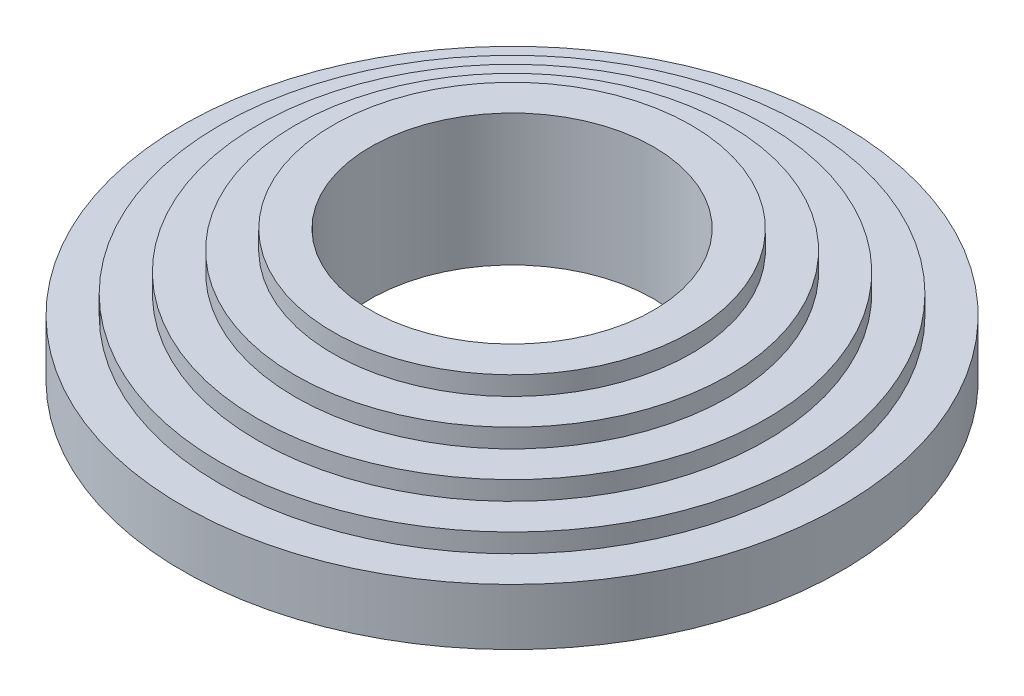
ISO-10303-21;
HEADER;
FILE_DESCRIPTION(('STEP AP214'),'2;1');
FILE_NAME('part.step','',(''),(''),'','','');
FILE_SCHEMA(('AUTOMOTIVE_DESIGN { 1 0 10303 214 1 1 1 1 }'));
ENDSEC;
DATA;
#1=APPLICATION_CONTEXT('core data for automotive mechanical design processes');
#2=APPLICATION_PROTOCOL_DEFINITION('international standard','automotive_design',2000,#1);
#3=PRODUCT_CONTEXT('',#1,'mechanical');
#4=PRODUCT('Part','Part','',(#3));
#5=PRODUCT_RELATED_PRODUCT_CATEGORY('part','',(#4));
#6=PRODUCT_DEFINITION_FORMATION('','',#4);
#7=PRODUCT_DEFINITION_CONTEXT('part definition',#1,'design');
#8=PRODUCT_DEFINITION('design','',#6,#7);
#9=PRODUCT_DEFINITION_SHAPE('','',#8);
#10=(LENGTH_UNIT() NAMED_UNIT(*) SI_UNIT(.MILLI.,.METRE.));
#11=(NAMED_UNIT(*) PLANE_ANGLE_UNIT() SI_UNIT($,.RADIAN.));
#12=(NAMED_UNIT(*) SI_UNIT($,.STERADIAN.) SOLID_ANGLE_UNIT());
#13=UNCERTAINTY_MEASURE_WITH_UNIT(LENGTH_MEASURE(1.E-05),#10,'distance_accuracy_value','');
#14=(GEOMETRIC_REPRESENTATION_CONTEXT(3) GLOBAL_UNCERTAINTY_ASSIGNED_CONTEXT((#13)) GLOBAL_UNIT_ASSIGNED_CONTEXT((#10,
#11,#12)) REPRESENTATION_CONTEXT('',''));
#15=CARTESIAN_POINT('',(0.,0.,0.));
#16=DIRECTION('',(0.,0.,1.));
#17=DIRECTION('',(1.,0.,0.));
#18=AXIS2_PLACEMENT_3D('',#15,#16,#17);
#19=CARTESIAN_POINT('',(0.,0.,0.));
#20=DIRECTION('',(0.,-1.,0.));
#21=DIRECTION('',(0.,0.,-1.));
#22=AXIS2_PLACEMENT_3D('',#19,#20,#21);
#23=CYLINDRICAL_SURFACE('',#22,44.73399997);
#24=CARTESIAN_POINT('',(0.,31.2160506837349,0.));
#25=DIRECTION('',(0.,-1.,0.));
#26=DIRECTION('',(0.,0.,-1.));
#27=AXIS2_PLACEMENT_3D('',#24,#25,#26);
#28=CIRCLE('',#27,44.73399997);
#29=CARTESIAN_POINT('',(0.,31.2160506837349,-44.73399997));
#30=VERTEX_POINT('',#29);
#31=EDGE_CURVE('E69',#30,#30,#28,.T.);
#32=ORIENTED_EDGE('',*,*,#31,.F.);
#33=EDGE_LOOP('',(#32));
#34=FACE_BOUND('',#33,.T.);
#35=CARTESIAN_POINT('',(0.,35.0970507957349,0.));
#36=DIRECTION('',(0.,-1.,0.));
#37=DIRECTION('',(0.,0.,-1.));
#38=AXIS2_PLACEMENT_3D('',#35,#36,#37);
#39=CIRCLE('',#38,44.73399997);
#40=CARTESIAN_POINT('',(0.,35.0970507957349,-44.73399997));
#41=VERTEX_POINT('',#40);
#42=EDGE_CURVE('E10',#41,#41,#39,.T.);
#43=ORIENTED_EDGE('',*,*,#42,.T.);
#44=EDGE_LOOP('',(#43));
#45=FACE_BOUND('',#44,.T.);
#46=ADVANCED_FACE('F29',(#34,#45),#23,.T.);
#47=CARTESIAN_POINT('',(-44.73399997,35.0970507957349,0.));
#48=DIRECTION('',(0.,-1.,0.));
#49=DIRECTION('',(0.,0.,-1.));
#50=AXIS2_PLACEMENT_3D('',#47,#48,#49);
#51=PLANE('',#50);
#52=ORIENTED_EDGE('',*,*,#42,.F.);
#53=EDGE_LOOP('',(#52));
#54=FACE_BOUND('',#53,.T.);
#55=CARTESIAN_POINT('',(0.,35.0970507957349,0.));
#56=DIRECTION('',(0.,-1.,0.));
#57=DIRECTION('',(0.,0.,-1.));
#58=AXIS2_PLACEMENT_3D('',#55,#56,#57);
#59=CIRCLE('',#58,36.972);
#60=CARTESIAN_POINT('',(0.,35.0970507957349,-36.972));
#61=VERTEX_POINT('',#60);
#62=EDGE_CURVE('E35',#61,#61,#59,.T.);
#63=ORIENTED_EDGE('',*,*,#62,.T.);
#64=EDGE_LOOP('',(#63));
#65=FACE_BOUND('',#64,.T.);
#66=ADVANCED_FACE('F76',(#54,#65),#51,.F.);
#67=CARTESIAN_POINT('',(0.,0.,0.));
#68=DIRECTION('',(0.,-1.,0.));
#69=DIRECTION('',(0.,0.,-1.));
#70=AXIS2_PLACEMENT_3D('',#67,#68,#69);
#71=CYLINDRICAL_SURFACE('',#70,36.972);
#72=ORIENTED_EDGE('',*,*,#62,.F.);
#73=EDGE_LOOP('',(#72));
#74=FACE_BOUND('',#73,.T.);
#75=CARTESIAN_POINT('',(0.,38.9780509077349,0.));
#76=DIRECTION('',(0.,-1.,0.));
#77=DIRECTION('',(0.,0.,-1.));
#78=AXIS2_PLACEMENT_3D('',#75,#76,#77);
#79=CIRCLE('',#78,36.972);
#80=CARTESIAN_POINT('',(0.,38.9780509077349,-36.972));
#81=VERTEX_POINT('',#80);
#82=EDGE_CURVE('E39',#81,#81,#79,.T.);
#83=ORIENTED_EDGE('',*,*,#82,.T.);
#84=EDGE_LOOP('',(#83));
#85=FACE_BOUND('',#84,.T.);
#86=ADVANCED_FACE('F80',(#74,#85),#71,.T.);
#87=CARTESIAN_POINT('',(-36.972,38.9780509077349,0.));
#88=DIRECTION('',(0.,-1.,0.));
#89=DIRECTION('',(0.,0.,-1.));
#90=AXIS2_PLACEMENT_3D('',#87,#88,#89);
#91=PLANE('',#90);
#92=ORIENTED_EDGE('',*,*,#82,.F.);
#93=EDGE_LOOP('',(#92));
#94=FACE_BOUND('',#93,.T.);
#95=CARTESIAN_POINT('',(0.,38.9780509077349,0.));
#96=DIRECTION('',(0.,-1.,0.));
#97=DIRECTION('',(0.,0.,-1.));
#98=AXIS2_PLACEMENT_3D('',#95,#96,#97);
#99=CIRCLE('',#98,29.21);
#100=CARTESIAN_POINT('',(0.,38.9780509077349,-29.21));
#101=VERTEX_POINT('',#100);
#102=EDGE_CURVE('E43',#101,#101,#99,.T.);
#103=ORIENTED_EDGE('',*,*,#102,.T.);
#104=EDGE_LOOP('',(#103));
#105=FACE_BOUND('',#104,.T.);
#106=ADVANCED_FACE('F85',(#94,#105),#91,.F.);
#107=CARTESIAN_POINT('',(0.,0.,0.));
#108=DIRECTION('',(0.,-1.,0.));
#109=DIRECTION('',(0.,0.,-1.));
#110=AXIS2_PLACEMENT_3D('',#107,#108,#109);
#111=CYLINDRICAL_SURFACE('',#110,29.21);
#112=ORIENTED_EDGE('',*,*,#102,.F.);
#113=EDGE_LOOP('',(#112));
#114=FACE_BOUND('',#113,.T.);
#115=CARTESIAN_POINT('',(0.,11.8110505717349,0.));
#116=DIRECTION('',(0.,-1.,0.));
#117=DIRECTION('',(0.,0.,-1.));
#118=AXIS2_PLACEMENT_3D('',#115,#116,#117);
#119=CIRCLE('',#118,29.21);
#120=CARTESIAN_POINT('',(0.,11.8110505717349,-29.21));
#121=VERTEX_POINT('',#120);
#122=EDGE_CURVE('E48',#121,#121,#119,.T.);
#123=ORIENTED_EDGE('',*,*,#122,.T.);
#124=EDGE_LOOP('',(#123));
#125=FACE_BOUND('',#124,.T.);
#126=ADVANCED_FACE('F91',(#114,#125),#111,.F.);
#127=CARTESIAN_POINT('',(-68.01999988,11.8110505717349,0.));
#128=DIRECTION('',(0.,1.,0.));
#129=DIRECTION('',(0.,0.,1.));
#130=AXIS2_PLACEMENT_3D('',#127,#128,#129);
#131=PLANE('',#130);
#132=ORIENTED_EDGE('',*,*,#122,.F.);
#133=EDGE_LOOP('',(#132));
#134=FACE_BOUND('',#133,.T.);
#135=CARTESIAN_POINT('',(0.,11.8110505717349,0.));
#136=DIRECTION('',(0.,-1.,0.));
#137=DIRECTION('',(0.,0.,-1.));
#138=AXIS2_PLACEMENT_3D('',#135,#136,#137);
#139=CIRCLE('',#138,68.01999988);
#140=CARTESIAN_POINT('',(0.,11.8110505717349,-68.01999988));
#141=VERTEX_POINT('',#140);
#142=EDGE_CURVE('E51',#141,#141,#139,.T.);
#143=ORIENTED_EDGE('',*,*,#142,.T.);
#144=EDGE_LOOP('',(#143));
#145=FACE_BOUND('',#144,.T.);
#146=ADVANCED_FACE('F95',(#134,#145),#131,.F.);
#147=CARTESIAN_POINT('',(0.,0.,0.));
#148=DIRECTION('',(0.,-1.,0.));
#149=DIRECTION('',(0.,0.,-1.));
#150=AXIS2_PLACEMENT_3D('',#147,#148,#149);
#151=CYLINDRICAL_SURFACE('',#150,68.01999988);
#152=ORIENTED_EDGE('',*,*,#142,.F.);
#153=EDGE_LOOP('',(#152));
#154=FACE_BOUND('',#153,.T.);
#155=CARTESIAN_POINT('',(0.,23.4540505717349,0.));
#156=DIRECTION('',(0.,-1.,0.));
#157=DIRECTION('',(0.,0.,-1.));
#158=AXIS2_PLACEMENT_3D('',#155,#156,#157);
#159=CIRCLE('',#158,68.01999988);
#160=CARTESIAN_POINT('',(0.,23.4540505717349,-68.01999988));
#161=VERTEX_POINT('',#160);
#162=EDGE_CURVE('E54',#161,#161,#159,.T.);
#163=ORIENTED_EDGE('',*,*,#162,.T.);
#164=EDGE_LOOP('',(#163));
#165=FACE_BOUND('',#164,.T.);
#166=ADVANCED_FACE('F99',(#154,#165),#151,.T.);
#167=CARTESIAN_POINT('',(-60.25799991,23.4540505717349,0.));
#168=DIRECTION('',(0.,-1.,0.));
#169=DIRECTION('',(0.,0.,-1.));
#170=AXIS2_PLACEMENT_3D('',#167,#168,#169);
#171=PLANE('',#170);
#172=ORIENTED_EDGE('',*,*,#162,.F.);
#173=EDGE_LOOP('',(#172));
#174=FACE_BOUND('',#173,.T.);
#175=CARTESIAN_POINT('',(0.,23.4540505717349,0.));
#176=DIRECTION('',(0.,-1.,0.));
#177=DIRECTION('',(0.,0.,-1.));
#178=AXIS2_PLACEMENT_3D('',#175,#176,#177);
#179=CIRCLE('',#178,60.25799991);
#180=CARTESIAN_POINT('',(0.,23.4540505717349,-60.25799991));
#181=VERTEX_POINT('',#180);
#182=EDGE_CURVE('E57',#181,#181,#179,.T.);
#183=ORIENTED_EDGE('',*,*,#182,.T.);
#184=EDGE_LOOP('',(#183));
#185=FACE_BOUND('',#184,.T.);
#186=ADVANCED_FACE('F103',(#174,#185),#171,.F.);
#187=CARTESIAN_POINT('',(0.,0.,0.));
#188=DIRECTION('',(0.,-1.,0.));
#189=DIRECTION('',(0.,0.,-1.));
#190=AXIS2_PLACEMENT_3D('',#187,#188,#189);
#191=CYLINDRICAL_SURFACE('',#190,60.25799991);
#192=ORIENTED_EDGE('',*,*,#182,.F.);
#193=EDGE_LOOP('',(#192));
#194=FACE_BOUND('',#193,.T.);
#195=CARTESIAN_POINT('',(0.,27.3350505717349,0.));
#196=DIRECTION('',(0.,-1.,0.));
#197=DIRECTION('',(0.,0.,-1.));
#198=AXIS2_PLACEMENT_3D('',#195,#196,#197);
#199=CIRCLE('',#198,60.25799991);
#200=CARTESIAN_POINT('',(0.,27.3350505717349,-60.25799991));
#201=VERTEX_POINT('',#200);
#202=EDGE_CURVE('E60',#201,#201,#199,.T.);
#203=ORIENTED_EDGE('',*,*,#202,.T.);
#204=EDGE_LOOP('',(#203));
#205=FACE_BOUND('',#204,.T.);
#206=ADVANCED_FACE('F107',(#194,#205),#191,.T.);
#207=CARTESIAN_POINT('',(-52.49599994,27.3350505717349,0.));
#208=DIRECTION('',(0.,-1.,0.));
#209=DIRECTION('',(0.,0.,-1.));
#210=AXIS2_PLACEMENT_3D('',#207,#208,#209);
#211=PLANE('',#210);
#212=ORIENTED_EDGE('',*,*,#202,.F.);
#213=EDGE_LOOP('',(#212));
#214=FACE_BOUND('',#213,.T.);
#215=CARTESIAN_POINT('',(0.,27.3350505717349,0.));
#216=DIRECTION('',(0.,-1.,0.));
#217=DIRECTION('',(0.,0.,-1.));
#218=AXIS2_PLACEMENT_3D('',#215,#216,#217);
#219=CIRCLE('',#218,52.49599994);
#220=CARTESIAN_POINT('',(0.,27.3350505717349,-52.49599994));
#221=VERTEX_POINT('',#220);
#222=EDGE_CURVE('E63',#221,#221,#219,.T.);
#223=ORIENTED_EDGE('',*,*,#222,.T.);
#224=EDGE_LOOP('',(#223));
#225=FACE_BOUND('',#224,.T.);
#226=ADVANCED_FACE('F111',(#214,#225),#211,.F.);
#227=CARTESIAN_POINT('',(0.,0.,0.));
#228=DIRECTION('',(0.,-1.,0.));
#229=DIRECTION('',(0.,0.,-1.));
#230=AXIS2_PLACEMENT_3D('',#227,#228,#229);
#231=CYLINDRICAL_SURFACE('',#230,52.49599994);
#232=ORIENTED_EDGE('',*,*,#222,.F.);
#233=EDGE_LOOP('',(#232));
#234=FACE_BOUND('',#233,.T.);
#235=CARTESIAN_POINT('',(0.,31.2160506837349,0.));
#236=DIRECTION('',(0.,-1.,0.));
#237=DIRECTION('',(0.,0.,-1.));
#238=AXIS2_PLACEMENT_3D('',#235,#236,#237);
#239=CIRCLE('',#238,52.49599994);
#240=CARTESIAN_POINT('',(0.,31.2160506837349,-52.49599994));
#241=VERTEX_POINT('',#240);
#242=EDGE_CURVE('E66',#241,#241,#239,.T.);
#243=ORIENTED_EDGE('',*,*,#242,.T.);
#244=EDGE_LOOP('',(#243));
#245=FACE_BOUND('',#244,.T.);
#246=ADVANCED_FACE('F115',(#234,#245),#231,.T.);
#247=CARTESIAN_POINT('',(-44.73399997,31.2160506837349,0.));
#248=DIRECTION('',(0.,-1.,0.));
#249=DIRECTION('',(0.,0.,-1.));
#250=AXIS2_PLACEMENT_3D('',#247,#248,#249);
#251=PLANE('',#250);
#252=ORIENTED_EDGE('',*,*,#242,.F.);
#253=EDGE_LOOP('',(#252));
#254=FACE_BOUND('',#253,.T.);
#255=ORIENTED_EDGE('',*,*,#31,.T.);
#256=EDGE_LOOP('',(#255));
#257=FACE_BOUND('',#256,.T.);
#258=ADVANCED_FACE('F73',(#254,#257),#251,.F.);
#259=CLOSED_SHELL('',(#46,#66,#86,#106,#126,#146,#166,#186,#206,#226,#246,#258));
#260=MANIFOLD_SOLID_BREP('B2',#259);
#261=ADVANCED_BREP_SHAPE_REPRESENTATION('',(#18,#260),#14);
#262=SHAPE_DEFINITION_REPRESENTATION(#9,#261);
ENDSEC;
END-ISO-10303-21;
